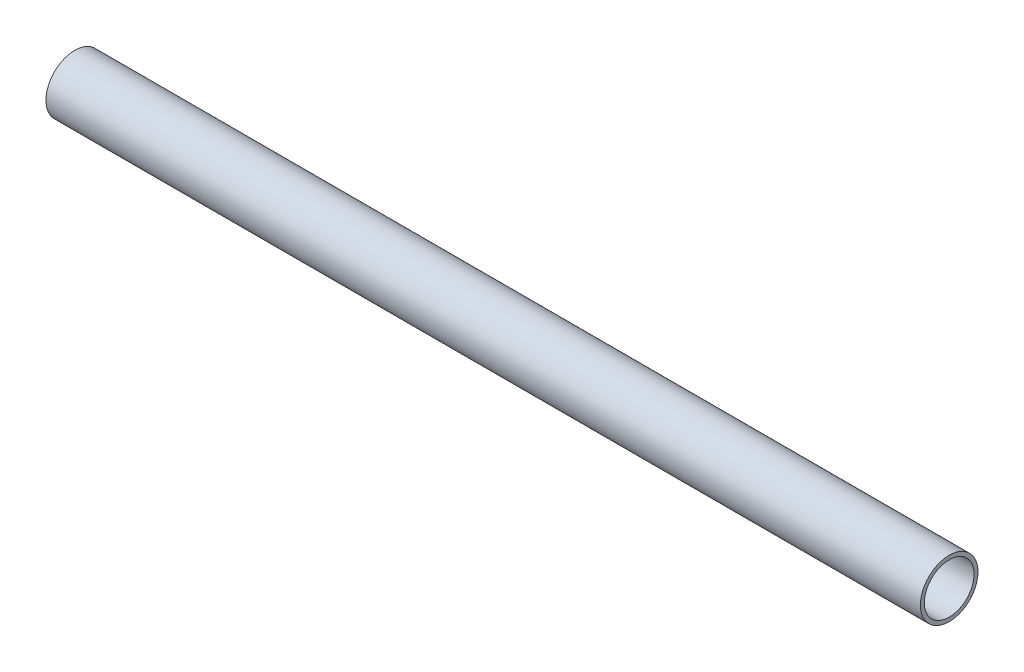
ISO-10303-21;
HEADER;
FILE_DESCRIPTION(('STEP AP214'),'2;1');
FILE_NAME('part.step','',(''),(''),'','','');
FILE_SCHEMA(('AUTOMOTIVE_DESIGN { 1 0 10303 214 1 1 1 1 }'));
ENDSEC;
DATA;
#1=APPLICATION_CONTEXT('core data for automotive mechanical design processes');
#2=APPLICATION_PROTOCOL_DEFINITION('international standard','automotive_design',2000,#1);
#3=PRODUCT_CONTEXT('',#1,'mechanical');
#4=PRODUCT('Part','Part','',(#3));
#5=PRODUCT_RELATED_PRODUCT_CATEGORY('part','',(#4));
#6=PRODUCT_DEFINITION_FORMATION('','',#4);
#7=PRODUCT_DEFINITION_CONTEXT('part definition',#1,'design');
#8=PRODUCT_DEFINITION('design','',#6,#7);
#9=PRODUCT_DEFINITION_SHAPE('','',#8);
#10=(LENGTH_UNIT() NAMED_UNIT(*) SI_UNIT(.MILLI.,.METRE.));
#11=(NAMED_UNIT(*) PLANE_ANGLE_UNIT() SI_UNIT($,.RADIAN.));
#12=(NAMED_UNIT(*) SI_UNIT($,.STERADIAN.) SOLID_ANGLE_UNIT());
#13=UNCERTAINTY_MEASURE_WITH_UNIT(LENGTH_MEASURE(1.E-05),#10,'distance_accuracy_value','');
#14=(GEOMETRIC_REPRESENTATION_CONTEXT(3) GLOBAL_UNCERTAINTY_ASSIGNED_CONTEXT((#13)) GLOBAL_UNIT_ASSIGNED_CONTEXT((#10,
#11,#12)) REPRESENTATION_CONTEXT('',''));
#15=CARTESIAN_POINT('',(0.,0.,0.));
#16=DIRECTION('',(0.,0.,1.));
#17=DIRECTION('',(1.,0.,0.));
#18=AXIS2_PLACEMENT_3D('',#15,#16,#17);
#19=CARTESIAN_POINT('',(-310.,0.,0.));
#20=DIRECTION('',(1.,0.,0.));
#21=DIRECTION('',(0.,0.,-1.));
#22=AXIS2_PLACEMENT_3D('',#19,#20,#21);
#23=CYLINDRICAL_SURFACE('',#22,11.);
#24=CARTESIAN_POINT('',(-310.,0.,0.));
#25=DIRECTION('',(1.,0.,0.));
#26=DIRECTION('',(0.,0.,-1.));
#27=AXIS2_PLACEMENT_3D('',#24,#25,#26);
#28=CIRCLE('',#27,11.);
#29=CARTESIAN_POINT('',(-310.,0.,-11.));
#30=VERTEX_POINT('',#29);
#31=EDGE_CURVE('E10',#30,#30,#28,.T.);
#32=ORIENTED_EDGE('',*,*,#31,.T.);
#33=EDGE_LOOP('',(#32));
#34=FACE_BOUND('',#33,.T.);
#35=CARTESIAN_POINT('',(24.,0.,0.));
#36=DIRECTION('',(1.,0.,0.));
#37=DIRECTION('',(0.,0.,-1.));
#38=AXIS2_PLACEMENT_3D('',#35,#36,#37);
#39=CIRCLE('',#38,11.);
#40=CARTESIAN_POINT('',(24.,0.,-11.));
#41=VERTEX_POINT('',#40);
#42=EDGE_CURVE('E41',#41,#41,#39,.T.);
#43=ORIENTED_EDGE('',*,*,#42,.F.);
#44=EDGE_LOOP('',(#43));
#45=FACE_BOUND('',#44,.T.);
#46=ADVANCED_FACE('F31',(#34,#45),#23,.T.);
#47=CARTESIAN_POINT('',(-310.,0.,0.));
#48=DIRECTION('',(1.,0.,0.));
#49=DIRECTION('',(0.,0.,-1.));
#50=AXIS2_PLACEMENT_3D('',#47,#48,#49);
#51=PLANE('',#50);
#52=CARTESIAN_POINT('',(-310.,0.,0.));
#53=DIRECTION('',(1.,0.,0.));
#54=DIRECTION('',(0.,0.,-1.));
#55=AXIS2_PLACEMENT_3D('',#52,#53,#54);
#56=CIRCLE('',#55,9.5);
#57=CARTESIAN_POINT('',(-310.,0.,-9.5));
#58=VERTEX_POINT('',#57);
#59=EDGE_CURVE('E37',#58,#58,#56,.T.);
#60=ORIENTED_EDGE('',*,*,#59,.T.);
#61=EDGE_LOOP('',(#60));
#62=FACE_BOUND('',#61,.T.);
#63=ORIENTED_EDGE('',*,*,#31,.F.);
#64=EDGE_LOOP('',(#63));
#65=FACE_BOUND('',#64,.T.);
#66=ADVANCED_FACE('F60',(#62,#65),#51,.F.);
#67=CARTESIAN_POINT('',(-310.,0.,0.));
#68=DIRECTION('',(1.,0.,0.));
#69=DIRECTION('',(0.,0.,-1.));
#70=AXIS2_PLACEMENT_3D('',#67,#68,#69);
#71=CYLINDRICAL_SURFACE('',#70,9.5);
#72=ORIENTED_EDGE('',*,*,#59,.F.);
#73=EDGE_LOOP('',(#72));
#74=FACE_BOUND('',#73,.T.);
#75=CARTESIAN_POINT('',(24.,0.,0.));
#76=DIRECTION('',(1.,0.,0.));
#77=DIRECTION('',(0.,0.,-1.));
#78=AXIS2_PLACEMENT_3D('',#75,#76,#77);
#79=CIRCLE('',#78,9.5);
#80=CARTESIAN_POINT('',(24.,0.,-9.5));
#81=VERTEX_POINT('',#80);
#82=EDGE_CURVE('E45',#81,#81,#79,.T.);
#83=ORIENTED_EDGE('',*,*,#82,.T.);
#84=EDGE_LOOP('',(#83));
#85=FACE_BOUND('',#84,.T.);
#86=ADVANCED_FACE('F51',(#74,#85),#71,.F.);
#87=CARTESIAN_POINT('',(24.,0.,0.));
#88=DIRECTION('',(1.,0.,0.));
#89=DIRECTION('',(0.,0.,-1.));
#90=AXIS2_PLACEMENT_3D('',#87,#88,#89);
#91=PLANE('',#90);
#92=ORIENTED_EDGE('',*,*,#42,.T.);
#93=EDGE_LOOP('',(#92));
#94=FACE_BOUND('',#93,.T.);
#95=ORIENTED_EDGE('',*,*,#82,.F.);
#96=EDGE_LOOP('',(#95));
#97=FACE_BOUND('',#96,.T.);
#98=ADVANCED_FACE('F53',(#94,#97),#91,.T.);
#99=CLOSED_SHELL('',(#46,#66,#86,#98));
#100=MANIFOLD_SOLID_BREP('B2',#99);
#101=ADVANCED_BREP_SHAPE_REPRESENTATION('',(#18,#100),#14);
#102=SHAPE_DEFINITION_REPRESENTATION(#9,#101);
ENDSEC;
END-ISO-10303-21;
